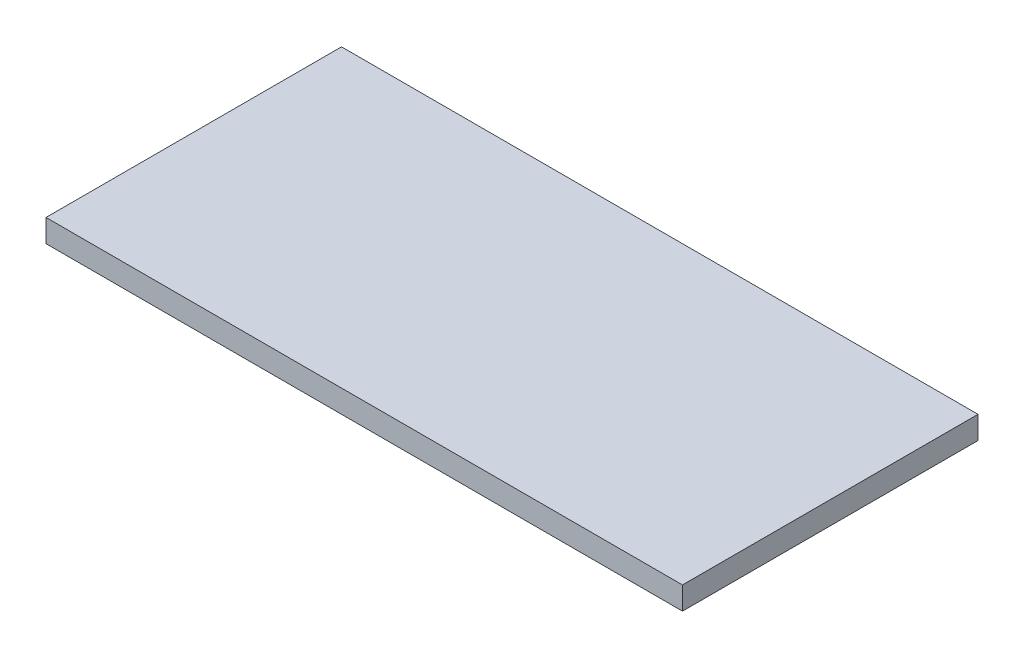
ISO-10303-21;
HEADER;
FILE_DESCRIPTION(('STEP AP214'),'2;1');
FILE_NAME('part.step','',(''),(''),'','','');
FILE_SCHEMA(('AUTOMOTIVE_DESIGN { 1 0 10303 214 1 1 1 1 }'));
ENDSEC;
DATA;
#1=APPLICATION_CONTEXT('core data for automotive mechanical design processes');
#2=APPLICATION_PROTOCOL_DEFINITION('international standard','automotive_design',2000,#1);
#3=PRODUCT_CONTEXT('',#1,'mechanical');
#4=PRODUCT('Part','Part','',(#3));
#5=PRODUCT_RELATED_PRODUCT_CATEGORY('part','',(#4));
#6=PRODUCT_DEFINITION_FORMATION('','',#4);
#7=PRODUCT_DEFINITION_CONTEXT('part definition',#1,'design');
#8=PRODUCT_DEFINITION('design','',#6,#7);
#9=PRODUCT_DEFINITION_SHAPE('','',#8);
#10=(LENGTH_UNIT() NAMED_UNIT(*) SI_UNIT(.MILLI.,.METRE.));
#11=(NAMED_UNIT(*) PLANE_ANGLE_UNIT() SI_UNIT($,.RADIAN.));
#12=(NAMED_UNIT(*) SI_UNIT($,.STERADIAN.) SOLID_ANGLE_UNIT());
#13=UNCERTAINTY_MEASURE_WITH_UNIT(LENGTH_MEASURE(1.E-05),#10,'distance_accuracy_value','');
#14=(GEOMETRIC_REPRESENTATION_CONTEXT(3) GLOBAL_UNCERTAINTY_ASSIGNED_CONTEXT((#13)) GLOBAL_UNIT_ASSIGNED_CONTEXT((#10,
#11,#12)) REPRESENTATION_CONTEXT('',''));
#15=CARTESIAN_POINT('',(0.,0.,0.));
#16=DIRECTION('',(0.,0.,1.));
#17=DIRECTION('',(1.,0.,0.));
#18=AXIS2_PLACEMENT_3D('',#15,#16,#17);
#19=CARTESIAN_POINT('',(-140.,10.,65.));
#20=DIRECTION('',(1.,0.,0.));
#21=DIRECTION('',(0.,0.,-1.));
#22=AXIS2_PLACEMENT_3D('',#19,#20,#21);
#23=PLANE('',#22);
#24=DIRECTION('',(0.,0.,1.));
#25=VECTOR('',#24,1.);
#26=CARTESIAN_POINT('',(-140.,0.,65.));
#27=LINE('',#26,#25);
#28=CARTESIAN_POINT('',(-140.,0.,-65.));
#29=VERTEX_POINT('',#28);
#30=CARTESIAN_POINT('',(-140.,0.,65.));
#31=VERTEX_POINT('',#30);
#32=EDGE_CURVE('E95',#29,#31,#27,.T.);
#33=ORIENTED_EDGE('',*,*,#32,.T.);
#34=DIRECTION('',(0.,-1.,0.));
#35=VECTOR('',#34,1.);
#36=CARTESIAN_POINT('',(-140.,10.,65.));
#37=LINE('',#36,#35);
#38=CARTESIAN_POINT('',(-140.,10.,65.));
#39=VERTEX_POINT('',#38);
#40=EDGE_CURVE('E11',#39,#31,#37,.T.);
#41=ORIENTED_EDGE('',*,*,#40,.F.);
#42=DIRECTION('',(0.,0.,1.));
#43=VECTOR('',#42,1.);
#44=CARTESIAN_POINT('',(-140.,10.,65.));
#45=LINE('',#44,#43);
#46=CARTESIAN_POINT('',(-140.,10.,-65.));
#47=VERTEX_POINT('',#46);
#48=EDGE_CURVE('E83',#47,#39,#45,.T.);
#49=ORIENTED_EDGE('',*,*,#48,.F.);
#50=DIRECTION('',(0.,-1.,0.));
#51=VECTOR('',#50,1.);
#52=CARTESIAN_POINT('',(-140.,10.,-65.));
#53=LINE('',#52,#51);
#54=EDGE_CURVE('E91',#47,#29,#53,.T.);
#55=ORIENTED_EDGE('',*,*,#54,.T.);
#56=EDGE_LOOP('',(#33,#41,#49,#55));
#57=FACE_BOUND('',#56,.T.);
#58=ADVANCED_FACE('F32',(#57),#23,.F.);
#59=CARTESIAN_POINT('',(-140.,10.,65.));
#60=DIRECTION('',(0.,0.,-1.));
#61=DIRECTION('',(-1.,0.,0.));
#62=AXIS2_PLACEMENT_3D('',#59,#60,#61);
#63=PLANE('',#62);
#64=DIRECTION('',(1.,0.,0.));
#65=VECTOR('',#64,1.);
#66=CARTESIAN_POINT('',(-140.,0.,65.));
#67=LINE('',#66,#65);
#68=CARTESIAN_POINT('',(140.,0.,65.));
#69=VERTEX_POINT('',#68);
#70=EDGE_CURVE('E87',#31,#69,#67,.T.);
#71=ORIENTED_EDGE('',*,*,#70,.T.);
#72=DIRECTION('',(0.,-1.,0.));
#73=VECTOR('',#72,1.);
#74=CARTESIAN_POINT('',(140.,10.,65.));
#75=LINE('',#74,#73);
#76=CARTESIAN_POINT('',(140.,10.,65.));
#77=VERTEX_POINT('',#76);
#78=EDGE_CURVE('E40',#77,#69,#75,.T.);
#79=ORIENTED_EDGE('',*,*,#78,.F.);
#80=DIRECTION('',(1.,0.,0.));
#81=VECTOR('',#80,1.);
#82=CARTESIAN_POINT('',(-140.,10.,65.));
#83=LINE('',#82,#81);
#84=EDGE_CURVE('E78',#39,#77,#83,.T.);
#85=ORIENTED_EDGE('',*,*,#84,.F.);
#86=ORIENTED_EDGE('',*,*,#40,.T.);
#87=EDGE_LOOP('',(#71,#79,#85,#86));
#88=FACE_BOUND('',#87,.T.);
#89=ADVANCED_FACE('F86',(#88),#63,.F.);
#90=CARTESIAN_POINT('',(140.,10.,65.));
#91=DIRECTION('',(-1.,0.,0.));
#92=DIRECTION('',(0.,0.,1.));
#93=AXIS2_PLACEMENT_3D('',#90,#91,#92);
#94=PLANE('',#93);
#95=DIRECTION('',(0.,0.,-1.));
#96=VECTOR('',#95,1.);
#97=CARTESIAN_POINT('',(140.,0.,65.));
#98=LINE('',#97,#96);
#99=CARTESIAN_POINT('',(140.,0.,-65.));
#100=VERTEX_POINT('',#99);
#101=EDGE_CURVE('E65',#69,#100,#98,.T.);
#102=ORIENTED_EDGE('',*,*,#101,.T.);
#103=DIRECTION('',(0.,-1.,0.));
#104=VECTOR('',#103,1.);
#105=CARTESIAN_POINT('',(140.,10.,-65.));
#106=LINE('',#105,#104);
#107=CARTESIAN_POINT('',(140.,10.,-65.));
#108=VERTEX_POINT('',#107);
#109=EDGE_CURVE('E88',#108,#100,#106,.T.);
#110=ORIENTED_EDGE('',*,*,#109,.F.);
#111=DIRECTION('',(0.,0.,-1.));
#112=VECTOR('',#111,1.);
#113=CARTESIAN_POINT('',(140.,10.,65.));
#114=LINE('',#113,#112);
#115=EDGE_CURVE('E81',#77,#108,#114,.T.);
#116=ORIENTED_EDGE('',*,*,#115,.F.);
#117=ORIENTED_EDGE('',*,*,#78,.T.);
#118=EDGE_LOOP('',(#102,#110,#116,#117));
#119=FACE_BOUND('',#118,.T.);
#120=ADVANCED_FACE('F89',(#119),#94,.F.);
#121=CARTESIAN_POINT('',(-140.,10.,-65.));
#122=DIRECTION('',(0.,0.,1.));
#123=DIRECTION('',(1.,0.,0.));
#124=AXIS2_PLACEMENT_3D('',#121,#122,#123);
#125=PLANE('',#124);
#126=DIRECTION('',(-1.,0.,0.));
#127=VECTOR('',#126,1.);
#128=CARTESIAN_POINT('',(-140.,0.,-65.));
#129=LINE('',#128,#127);
#130=EDGE_CURVE('E71',#100,#29,#129,.T.);
#131=ORIENTED_EDGE('',*,*,#130,.T.);
#132=ORIENTED_EDGE('',*,*,#54,.F.);
#133=DIRECTION('',(-1.,0.,0.));
#134=VECTOR('',#133,1.);
#135=CARTESIAN_POINT('',(-140.,10.,-65.));
#136=LINE('',#135,#134);
#137=EDGE_CURVE('E48',#108,#47,#136,.T.);
#138=ORIENTED_EDGE('',*,*,#137,.F.);
#139=ORIENTED_EDGE('',*,*,#109,.T.);
#140=EDGE_LOOP('',(#131,#132,#138,#139));
#141=FACE_BOUND('',#140,.T.);
#142=ADVANCED_FACE('F102',(#141),#125,.F.);
#143=CARTESIAN_POINT('',(0.,10.,0.));
#144=DIRECTION('',(0.,-1.,0.));
#145=DIRECTION('',(0.,0.,-1.));
#146=AXIS2_PLACEMENT_3D('',#143,#144,#145);
#147=PLANE('',#146);
#148=ORIENTED_EDGE('',*,*,#48,.T.);
#149=ORIENTED_EDGE('',*,*,#84,.T.);
#150=ORIENTED_EDGE('',*,*,#115,.T.);
#151=ORIENTED_EDGE('',*,*,#137,.T.);
#152=EDGE_LOOP('',(#148,#149,#150,#151));
#153=FACE_BOUND('',#152,.T.);
#154=ADVANCED_FACE('F79',(#153),#147,.F.);
#155=CARTESIAN_POINT('',(0.,0.,0.));
#156=DIRECTION('',(0.,-1.,0.));
#157=DIRECTION('',(0.,0.,-1.));
#158=AXIS2_PLACEMENT_3D('',#155,#156,#157);
#159=PLANE('',#158);
#160=ORIENTED_EDGE('',*,*,#32,.F.);
#161=ORIENTED_EDGE('',*,*,#130,.F.);
#162=ORIENTED_EDGE('',*,*,#101,.F.);
#163=ORIENTED_EDGE('',*,*,#70,.F.);
#164=EDGE_LOOP('',(#160,#161,#162,#163));
#165=FACE_BOUND('',#164,.T.);
#166=ADVANCED_FACE('F105',(#165),#159,.T.);
#167=CLOSED_SHELL('',(#58,#89,#120,#142,#154,#166));
#168=MANIFOLD_SOLID_BREP('B2',#167);
#169=ADVANCED_BREP_SHAPE_REPRESENTATION('',(#18,#168),#14);
#170=SHAPE_DEFINITION_REPRESENTATION(#9,#169);
ENDSEC;
END-ISO-10303-21;
